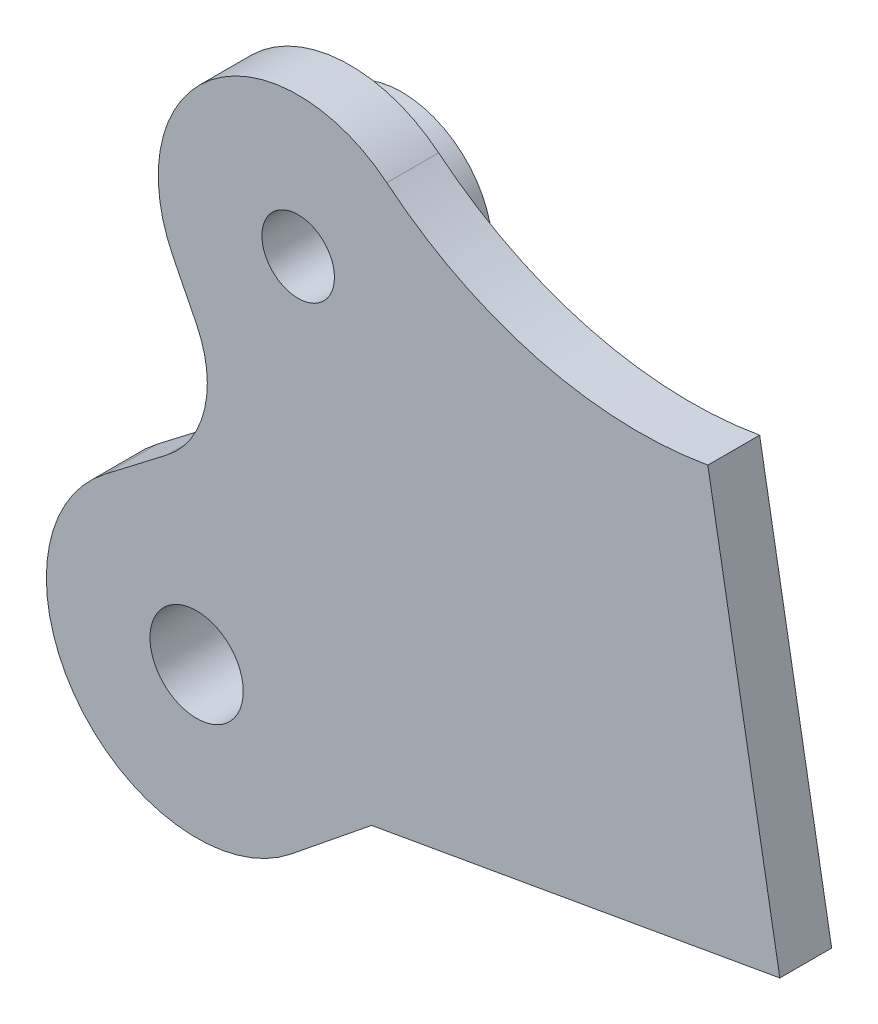
ISO-10303-21;
HEADER;
FILE_DESCRIPTION(('STEP AP214'),'2;1');
FILE_NAME('part.step','',(''),(''),'','','');
FILE_SCHEMA(('AUTOMOTIVE_DESIGN { 1 0 10303 214 1 1 1 1 }'));
ENDSEC;
DATA;
#1=APPLICATION_CONTEXT('core data for automotive mechanical design processes');
#2=APPLICATION_PROTOCOL_DEFINITION('international standard','automotive_design',2000,#1);
#3=PRODUCT_CONTEXT('',#1,'mechanical');
#4=PRODUCT('Part','Part','',(#3));
#5=PRODUCT_RELATED_PRODUCT_CATEGORY('part','',(#4));
#6=PRODUCT_DEFINITION_FORMATION('','',#4);
#7=PRODUCT_DEFINITION_CONTEXT('part definition',#1,'design');
#8=PRODUCT_DEFINITION('design','',#6,#7);
#9=PRODUCT_DEFINITION_SHAPE('','',#8);
#10=(LENGTH_UNIT() NAMED_UNIT(*) SI_UNIT(.MILLI.,.METRE.));
#11=(NAMED_UNIT(*) PLANE_ANGLE_UNIT() SI_UNIT($,.RADIAN.));
#12=(NAMED_UNIT(*) SI_UNIT($,.STERADIAN.) SOLID_ANGLE_UNIT());
#13=UNCERTAINTY_MEASURE_WITH_UNIT(LENGTH_MEASURE(1.E-05),#10,'distance_accuracy_value','');
#14=(GEOMETRIC_REPRESENTATION_CONTEXT(3) GLOBAL_UNCERTAINTY_ASSIGNED_CONTEXT((#13)) GLOBAL_UNIT_ASSIGNED_CONTEXT((#10,
#11,#12)) REPRESENTATION_CONTEXT('',''));
#15=CARTESIAN_POINT('',(0.,0.,0.));
#16=DIRECTION('',(0.,0.,1.));
#17=DIRECTION('',(1.,0.,0.));
#18=AXIS2_PLACEMENT_3D('',#15,#16,#17);
#19=CARTESIAN_POINT('',(0.,0.,-5.));
#20=DIRECTION('',(0.,0.,1.));
#21=DIRECTION('',(1.,0.,0.));
#22=AXIS2_PLACEMENT_3D('',#19,#20,#21);
#23=PLANE('',#22);
#24=CARTESIAN_POINT('',(0.,0.,-5.));
#25=DIRECTION('',(0.,0.,1.));
#26=DIRECTION('',(1.,0.,0.));
#27=AXIS2_PLACEMENT_3D('',#24,#25,#26);
#28=CIRCLE('',#27,8.75);
#29=CARTESIAN_POINT('',(8.75,0.,-5.));
#30=VERTEX_POINT('',#29);
#31=EDGE_CURVE('E40',#30,#30,#28,.F.);
#32=ORIENTED_EDGE('',*,*,#31,.F.);
#33=EDGE_LOOP('',(#32));
#34=FACE_BOUND('',#33,.T.);
#35=CARTESIAN_POINT('',(0.,0.,-5.));
#36=DIRECTION('',(0.,0.,1.));
#37=DIRECTION('',(1.,0.,0.));
#38=AXIS2_PLACEMENT_3D('',#35,#36,#37);
#39=CIRCLE('',#38,13.5);
#40=CARTESIAN_POINT('',(8.55471029514315,10.4435114672304,-5.));
#41=VERTEX_POINT('',#40);
#42=CARTESIAN_POINT('',(-12.0688625539661,-6.04917818000722,-5.));
#43=VERTEX_POINT('',#42);
#44=EDGE_CURVE('E162',#41,#43,#39,.T.);
#45=ORIENTED_EDGE('',*,*,#44,.F.);
#46=CARTESIAN_POINT('',(32.8720415648223,40.1298853134043,-5.));
#47=DIRECTION('',(0.,0.,-1.));
#48=DIRECTION('',(1.,0.,0.));
#49=AXIS2_PLACEMENT_3D('',#46,#47,#48);
#50=CIRCLE('',#49,38.3746451737878);
#51=CARTESIAN_POINT('',(39.5357287678656,2.33823722716558,-5.));
#52=VERTEX_POINT('',#51);
#53=EDGE_CURVE('E127',#52,#41,#50,.T.);
#54=ORIENTED_EDGE('',*,*,#53,.F.);
#55=DIRECTION('',(-0.173648177666932,0.984807753012208,0.));
#56=VECTOR('',#55,1.);
#57=CARTESIAN_POINT('',(46.4816558745429,-37.0540728933227,-5.));
#58=LINE('',#57,#56);
#59=CARTESIAN_POINT('',(46.4816558745429,-37.0540728933227,-5.));
#60=VERTEX_POINT('',#59);
#61=EDGE_CURVE('E112',#60,#52,#58,.T.);
#62=ORIENTED_EDGE('',*,*,#61,.F.);
#63=DIRECTION('',(0.984807753012208,0.173648177666931,0.));
#64=VECTOR('',#63,1.);
#65=CARTESIAN_POINT('',(7.08934575405454,-44.,-5.));
#66=LINE('',#65,#64);
#67=CARTESIAN_POINT('',(7.08934575405454,-44.,-5.));
#68=VERTEX_POINT('',#67);
#69=EDGE_CURVE('E125',#68,#60,#66,.T.);
#70=ORIENTED_EDGE('',*,*,#69,.F.);
#71=DIRECTION('',(0.778061104079115,0.628188600914716,0.));
#72=VECTOR('',#71,1.);
#73=CARTESIAN_POINT('',(-0.691265286736606,-50.2818860091472,-5.));
#74=LINE('',#73,#72);
#75=CARTESIAN_POINT('',(-0.691265286736614,-50.2818860091472,-5.));
#76=VERTEX_POINT('',#75);
#77=EDGE_CURVE('E130',#76,#68,#74,.T.);
#78=ORIENTED_EDGE('',*,*,#77,.F.);
#79=CARTESIAN_POINT('',(-9.79999999999999,-39.,-5.));
#80=DIRECTION('',(0.,0.,1.));
#81=DIRECTION('',(1.,0.,0.));
#82=AXIS2_PLACEMENT_3D('',#79,#80,#81);
#83=CIRCLE('',#82,14.5);
#84=CARTESIAN_POINT('',(-18.6271176616217,-27.4964356050881,-5.));
#85=VERTEX_POINT('',#84);
#86=EDGE_CURVE('E132',#85,#76,#83,.T.);
#87=ORIENTED_EDGE('',*,*,#86,.F.);
#88=DIRECTION('',(-0.793349268614616,-0.608766735284258,0.));
#89=VECTOR('',#88,1.);
#90=CARTESIAN_POINT('',(-12.6806570262809,-22.9334926861462,-5.));
#91=LINE('',#90,#89);
#92=CARTESIAN_POINT('',(-12.6806570262809,-22.9334926861462,-5.));
#93=VERTEX_POINT('',#92);
#94=EDGE_CURVE('E229',#93,#85,#91,.T.);
#95=ORIENTED_EDGE('',*,*,#94,.F.);
#96=CARTESIAN_POINT('',(-18.7683243791235,-15.,-5.));
#97=DIRECTION('',(0.,0.,-1.));
#98=DIRECTION('',(1.,0.,0.));
#99=AXIS2_PLACEMENT_3D('',#96,#97,#98);
#100=CIRCLE('',#99,10.);
#101=CARTESIAN_POINT('',(-9.82842619100044,-10.5191272740687,-5.));
#102=VERTEX_POINT('',#101);
#103=EDGE_CURVE('E222',#102,#93,#100,.T.);
#104=ORIENTED_EDGE('',*,*,#103,.F.);
#105=DIRECTION('',(0.448087272593127,-0.893989818812302,0.));
#106=VECTOR('',#105,1.);
#107=CARTESIAN_POINT('',(-12.0688625539661,-6.04917818000722,-5.));
#108=LINE('',#107,#106);
#109=EDGE_CURVE('E220',#43,#102,#108,.T.);
#110=ORIENTED_EDGE('',*,*,#109,.F.);
#111=EDGE_LOOP('',(#45,#54,#62,#70,#78,#87,#95,#104,#110));
#112=FACE_BOUND('',#111,.T.);
#113=CARTESIAN_POINT('',(-9.79999999999999,-39.,-5.));
#114=DIRECTION('',(0.,0.,1.));
#115=DIRECTION('',(1.,0.,0.));
#116=AXIS2_PLACEMENT_3D('',#113,#114,#115);
#117=CIRCLE('',#116,8.75);
#118=CARTESIAN_POINT('',(-1.04999999999999,-39.,-5.));
#119=VERTEX_POINT('',#118);
#120=EDGE_CURVE('E11',#119,#119,#117,.F.);
#121=ORIENTED_EDGE('',*,*,#120,.F.);
#122=EDGE_LOOP('',(#121));
#123=FACE_BOUND('',#122,.T.);
#124=ADVANCED_FACE('F31',(#34,#112,#123),#23,.F.);
#125=CARTESIAN_POINT('',(0.,0.,-5.));
#126=DIRECTION('',(0.,0.,1.));
#127=DIRECTION('',(1.,0.,0.));
#128=AXIS2_PLACEMENT_3D('',#125,#126,#127);
#129=CYLINDRICAL_SURFACE('',#128,13.5);
#130=CARTESIAN_POINT('',(0.,0.,0.));
#131=DIRECTION('',(0.,0.,1.));
#132=DIRECTION('',(1.,0.,0.));
#133=AXIS2_PLACEMENT_3D('',#130,#131,#132);
#134=CIRCLE('',#133,13.5);
#135=CARTESIAN_POINT('',(8.55471029514315,10.4435114672304,0.));
#136=VERTEX_POINT('',#135);
#137=CARTESIAN_POINT('',(-12.0688625539661,-6.04917818000722,0.));
#138=VERTEX_POINT('',#137);
#139=EDGE_CURVE('E137',#136,#138,#134,.T.);
#140=ORIENTED_EDGE('',*,*,#139,.F.);
#141=DIRECTION('',(0.,0.,1.));
#142=VECTOR('',#141,1.);
#143=CARTESIAN_POINT('',(8.55471029514315,10.4435114672304,-5.));
#144=LINE('',#143,#142);
#145=EDGE_CURVE('E48',#41,#136,#144,.T.);
#146=ORIENTED_EDGE('',*,*,#145,.F.);
#147=ORIENTED_EDGE('',*,*,#44,.T.);
#148=DIRECTION('',(0.,0.,1.));
#149=VECTOR('',#148,1.);
#150=CARTESIAN_POINT('',(-12.0688625539661,-6.04917818000722,-5.));
#151=LINE('',#150,#149);
#152=EDGE_CURVE('E92',#43,#138,#151,.T.);
#153=ORIENTED_EDGE('',*,*,#152,.T.);
#154=EDGE_LOOP('',(#140,#146,#147,#153));
#155=FACE_BOUND('',#154,.T.);
#156=ADVANCED_FACE('F33',(#155),#129,.T.);
#157=CARTESIAN_POINT('',(32.8720415648223,40.1298853134043,-5.));
#158=DIRECTION('',(0.,0.,1.));
#159=DIRECTION('',(1.,0.,0.));
#160=AXIS2_PLACEMENT_3D('',#157,#158,#159);
#161=CYLINDRICAL_SURFACE('',#160,38.3746451737878);
#162=CARTESIAN_POINT('',(32.8720415648223,40.1298853134043,0.));
#163=DIRECTION('',(0.,0.,-1.));
#164=DIRECTION('',(1.,0.,0.));
#165=AXIS2_PLACEMENT_3D('',#162,#163,#164);
#166=CIRCLE('',#165,38.3746451737878);
#167=CARTESIAN_POINT('',(39.5357287678656,2.33823722716558,0.));
#168=VERTEX_POINT('',#167);
#169=EDGE_CURVE('E159',#168,#136,#166,.T.);
#170=ORIENTED_EDGE('',*,*,#169,.F.);
#171=DIRECTION('',(0.,0.,1.));
#172=VECTOR('',#171,1.);
#173=CARTESIAN_POINT('',(39.5357287678656,2.33823722716558,-5.));
#174=LINE('',#173,#172);
#175=EDGE_CURVE('E80',#52,#168,#174,.T.);
#176=ORIENTED_EDGE('',*,*,#175,.F.);
#177=ORIENTED_EDGE('',*,*,#53,.T.);
#178=ORIENTED_EDGE('',*,*,#145,.T.);
#179=EDGE_LOOP('',(#170,#176,#177,#178));
#180=FACE_BOUND('',#179,.T.);
#181=ADVANCED_FACE('F184',(#180),#161,.F.);
#182=CARTESIAN_POINT('',(46.4816558745429,-37.0540728933227,-5.));
#183=DIRECTION('',(0.984807753012208,0.173648177666932,0.));
#184=DIRECTION('',(-0.173648177666932,0.984807753012208,0.));
#185=AXIS2_PLACEMENT_3D('',#182,#183,#184);
#186=PLANE('',#185);
#187=DIRECTION('',(-0.173648177666932,0.984807753012208,0.));
#188=VECTOR('',#187,1.);
#189=CARTESIAN_POINT('',(46.4816558745429,-37.0540728933227,0.));
#190=LINE('',#189,#188);
#191=CARTESIAN_POINT('',(46.4816558745429,-37.0540728933227,0.));
#192=VERTEX_POINT('',#191);
#193=EDGE_CURVE('E114',#192,#168,#190,.T.);
#194=ORIENTED_EDGE('',*,*,#193,.F.);
#195=DIRECTION('',(0.,0.,1.));
#196=VECTOR('',#195,1.);
#197=CARTESIAN_POINT('',(46.4816558745429,-37.0540728933227,-5.));
#198=LINE('',#197,#196);
#199=EDGE_CURVE('E109',#60,#192,#198,.T.);
#200=ORIENTED_EDGE('',*,*,#199,.F.);
#201=ORIENTED_EDGE('',*,*,#61,.T.);
#202=ORIENTED_EDGE('',*,*,#175,.T.);
#203=EDGE_LOOP('',(#194,#200,#201,#202));
#204=FACE_BOUND('',#203,.T.);
#205=ADVANCED_FACE('F111',(#204),#186,.T.);
#206=CARTESIAN_POINT('',(7.08934575405454,-44.,-5.));
#207=DIRECTION('',(0.173648177666931,-0.984807753012208,0.));
#208=DIRECTION('',(0.984807753012208,0.173648177666931,0.));
#209=AXIS2_PLACEMENT_3D('',#206,#207,#208);
#210=PLANE('',#209);
#211=DIRECTION('',(0.984807753012208,0.173648177666931,0.));
#212=VECTOR('',#211,1.);
#213=CARTESIAN_POINT('',(7.08934575405454,-44.,0.));
#214=LINE('',#213,#212);
#215=CARTESIAN_POINT('',(7.08934575405454,-44.,0.));
#216=VERTEX_POINT('',#215);
#217=EDGE_CURVE('E156',#216,#192,#214,.T.);
#218=ORIENTED_EDGE('',*,*,#217,.F.);
#219=DIRECTION('',(0.,0.,1.));
#220=VECTOR('',#219,1.);
#221=CARTESIAN_POINT('',(7.08934575405454,-44.,-5.));
#222=LINE('',#221,#220);
#223=EDGE_CURVE('E119',#68,#216,#222,.T.);
#224=ORIENTED_EDGE('',*,*,#223,.F.);
#225=ORIENTED_EDGE('',*,*,#69,.T.);
#226=ORIENTED_EDGE('',*,*,#199,.T.);
#227=EDGE_LOOP('',(#218,#224,#225,#226));
#228=FACE_BOUND('',#227,.T.);
#229=ADVANCED_FACE('F129',(#228),#210,.T.);
#230=CARTESIAN_POINT('',(-0.691265286736606,-50.2818860091472,-5.));
#231=DIRECTION('',(0.628188600914716,-0.778061104079115,0.));
#232=DIRECTION('',(0.778061104079115,0.628188600914716,0.));
#233=AXIS2_PLACEMENT_3D('',#230,#231,#232);
#234=PLANE('',#233);
#235=DIRECTION('',(0.778061104079115,0.628188600914716,0.));
#236=VECTOR('',#235,1.);
#237=CARTESIAN_POINT('',(-0.691265286736606,-50.2818860091472,0.));
#238=LINE('',#237,#236);
#239=CARTESIAN_POINT('',(-0.691265286736614,-50.2818860091472,0.));
#240=VERTEX_POINT('',#239);
#241=EDGE_CURVE('E153',#240,#216,#238,.T.);
#242=ORIENTED_EDGE('',*,*,#241,.F.);
#243=DIRECTION('',(0.,0.,1.));
#244=VECTOR('',#243,1.);
#245=CARTESIAN_POINT('',(-0.691265286736614,-50.2818860091472,-5.));
#246=LINE('',#245,#244);
#247=EDGE_CURVE('E166',#76,#240,#246,.T.);
#248=ORIENTED_EDGE('',*,*,#247,.F.);
#249=ORIENTED_EDGE('',*,*,#77,.T.);
#250=ORIENTED_EDGE('',*,*,#223,.T.);
#251=EDGE_LOOP('',(#242,#248,#249,#250));
#252=FACE_BOUND('',#251,.T.);
#253=ADVANCED_FACE('F200',(#252),#234,.T.);
#254=CARTESIAN_POINT('',(-9.79999999999999,-39.,-5.));
#255=DIRECTION('',(0.,0.,1.));
#256=DIRECTION('',(1.,0.,0.));
#257=AXIS2_PLACEMENT_3D('',#254,#255,#256);
#258=CYLINDRICAL_SURFACE('',#257,14.5);
#259=CARTESIAN_POINT('',(-9.79999999999999,-39.,0.));
#260=DIRECTION('',(0.,0.,1.));
#261=DIRECTION('',(1.,0.,0.));
#262=AXIS2_PLACEMENT_3D('',#259,#260,#261);
#263=CIRCLE('',#262,14.5);
#264=CARTESIAN_POINT('',(-18.6271176616217,-27.4964356050881,0.));
#265=VERTEX_POINT('',#264);
#266=EDGE_CURVE('E150',#265,#240,#263,.T.);
#267=ORIENTED_EDGE('',*,*,#266,.F.);
#268=DIRECTION('',(0.,0.,1.));
#269=VECTOR('',#268,1.);
#270=CARTESIAN_POINT('',(-18.6271176616217,-27.4964356050881,-5.));
#271=LINE('',#270,#269);
#272=EDGE_CURVE('E168',#85,#265,#271,.T.);
#273=ORIENTED_EDGE('',*,*,#272,.F.);
#274=ORIENTED_EDGE('',*,*,#86,.T.);
#275=ORIENTED_EDGE('',*,*,#247,.T.);
#276=EDGE_LOOP('',(#267,#273,#274,#275));
#277=FACE_BOUND('',#276,.T.);
#278=ADVANCED_FACE('F203',(#277),#258,.T.);
#279=CARTESIAN_POINT('',(-12.6806570262809,-22.9334926861462,-5.));
#280=DIRECTION('',(-0.608766735284258,0.793349268614616,0.));
#281=DIRECTION('',(-0.793349268614616,-0.608766735284258,0.));
#282=AXIS2_PLACEMENT_3D('',#279,#280,#281);
#283=PLANE('',#282);
#284=DIRECTION('',(-0.793349268614616,-0.608766735284258,0.));
#285=VECTOR('',#284,1.);
#286=CARTESIAN_POINT('',(-12.6806570262809,-22.9334926861462,0.));
#287=LINE('',#286,#285);
#288=CARTESIAN_POINT('',(-12.6806570262809,-22.9334926861462,0.));
#289=VERTEX_POINT('',#288);
#290=EDGE_CURVE('E147',#289,#265,#287,.T.);
#291=ORIENTED_EDGE('',*,*,#290,.F.);
#292=DIRECTION('',(0.,0.,1.));
#293=VECTOR('',#292,1.);
#294=CARTESIAN_POINT('',(-12.6806570262809,-22.9334926861462,-5.));
#295=LINE('',#294,#293);
#296=EDGE_CURVE('E170',#93,#289,#295,.T.);
#297=ORIENTED_EDGE('',*,*,#296,.F.);
#298=ORIENTED_EDGE('',*,*,#94,.T.);
#299=ORIENTED_EDGE('',*,*,#272,.T.);
#300=EDGE_LOOP('',(#291,#297,#298,#299));
#301=FACE_BOUND('',#300,.T.);
#302=ADVANCED_FACE('F207',(#301),#283,.T.);
#303=CARTESIAN_POINT('',(-18.7683243791235,-15.,-5.));
#304=DIRECTION('',(0.,0.,1.));
#305=DIRECTION('',(1.,0.,0.));
#306=AXIS2_PLACEMENT_3D('',#303,#304,#305);
#307=CYLINDRICAL_SURFACE('',#306,10.);
#308=CARTESIAN_POINT('',(-18.7683243791235,-15.,0.));
#309=DIRECTION('',(0.,0.,-1.));
#310=DIRECTION('',(1.,0.,0.));
#311=AXIS2_PLACEMENT_3D('',#308,#309,#310);
#312=CIRCLE('',#311,10.);
#313=CARTESIAN_POINT('',(-9.82842619100044,-10.5191272740687,0.));
#314=VERTEX_POINT('',#313);
#315=EDGE_CURVE('E144',#314,#289,#312,.T.);
#316=ORIENTED_EDGE('',*,*,#315,.F.);
#317=DIRECTION('',(0.,0.,1.));
#318=VECTOR('',#317,1.);
#319=CARTESIAN_POINT('',(-9.82842619100044,-10.5191272740687,-5.));
#320=LINE('',#319,#318);
#321=EDGE_CURVE('E172',#102,#314,#320,.T.);
#322=ORIENTED_EDGE('',*,*,#321,.F.);
#323=ORIENTED_EDGE('',*,*,#103,.T.);
#324=ORIENTED_EDGE('',*,*,#296,.T.);
#325=EDGE_LOOP('',(#316,#322,#323,#324));
#326=FACE_BOUND('',#325,.T.);
#327=ADVANCED_FACE('F211',(#326),#307,.F.);
#328=CARTESIAN_POINT('',(-12.0688625539661,-6.04917818000722,-5.));
#329=DIRECTION('',(-0.893989818812302,-0.448087272593127,0.));
#330=DIRECTION('',(0.448087272593127,-0.893989818812302,0.));
#331=AXIS2_PLACEMENT_3D('',#328,#329,#330);
#332=PLANE('',#331);
#333=DIRECTION('',(0.448087272593127,-0.893989818812302,0.));
#334=VECTOR('',#333,1.);
#335=CARTESIAN_POINT('',(-12.0688625539661,-6.04917818000722,0.));
#336=LINE('',#335,#334);
#337=EDGE_CURVE('E140',#138,#314,#336,.T.);
#338=ORIENTED_EDGE('',*,*,#337,.F.);
#339=ORIENTED_EDGE('',*,*,#152,.F.);
#340=ORIENTED_EDGE('',*,*,#109,.T.);
#341=ORIENTED_EDGE('',*,*,#321,.T.);
#342=EDGE_LOOP('',(#338,#339,#340,#341));
#343=FACE_BOUND('',#342,.T.);
#344=ADVANCED_FACE('F192',(#343),#332,.T.);
#345=CARTESIAN_POINT('',(0.,0.,0.));
#346=DIRECTION('',(0.,0.,1.));
#347=DIRECTION('',(1.,0.,0.));
#348=AXIS2_PLACEMENT_3D('',#345,#346,#347);
#349=PLANE('',#348);
#350=CARTESIAN_POINT('',(-9.79999999999999,-39.,0.));
#351=DIRECTION('',(0.,0.,1.));
#352=DIRECTION('',(1.,0.,0.));
#353=AXIS2_PLACEMENT_3D('',#350,#351,#352);
#354=CIRCLE('',#353,4.5);
#355=CARTESIAN_POINT('',(-5.29999999999999,-39.,0.));
#356=VERTEX_POINT('',#355);
#357=EDGE_CURVE('E239',#356,#356,#354,.T.);
#358=ORIENTED_EDGE('',*,*,#357,.F.);
#359=EDGE_LOOP('',(#358));
#360=FACE_BOUND('',#359,.T.);
#361=CARTESIAN_POINT('',(0.,0.,0.));
#362=DIRECTION('',(0.,0.,1.));
#363=DIRECTION('',(1.,0.,0.));
#364=AXIS2_PLACEMENT_3D('',#361,#362,#363);
#365=CIRCLE('',#364,3.5);
#366=CARTESIAN_POINT('',(3.5,0.,0.));
#367=VERTEX_POINT('',#366);
#368=EDGE_CURVE('E141',#367,#367,#365,.T.);
#369=ORIENTED_EDGE('',*,*,#368,.F.);
#370=EDGE_LOOP('',(#369));
#371=FACE_BOUND('',#370,.T.);
#372=ORIENTED_EDGE('',*,*,#139,.T.);
#373=ORIENTED_EDGE('',*,*,#337,.T.);
#374=ORIENTED_EDGE('',*,*,#315,.T.);
#375=ORIENTED_EDGE('',*,*,#290,.T.);
#376=ORIENTED_EDGE('',*,*,#266,.T.);
#377=ORIENTED_EDGE('',*,*,#241,.T.);
#378=ORIENTED_EDGE('',*,*,#217,.T.);
#379=ORIENTED_EDGE('',*,*,#193,.T.);
#380=ORIENTED_EDGE('',*,*,#169,.T.);
#381=EDGE_LOOP('',(#372,#373,#374,#375,#376,#377,#378,#379,#380));
#382=FACE_BOUND('',#381,.T.);
#383=ADVANCED_FACE('F189',(#360,#371,#382),#349,.T.);
#384=CARTESIAN_POINT('',(0.,0.,-5.));
#385=DIRECTION('',(0.,0.,1.));
#386=DIRECTION('',(1.,0.,0.));
#387=AXIS2_PLACEMENT_3D('',#384,#385,#386);
#388=CYLINDRICAL_SURFACE('',#387,3.5);
#389=ORIENTED_EDGE('',*,*,#368,.T.);
#390=EDGE_LOOP('',(#389));
#391=FACE_BOUND('',#390,.T.);
#392=CARTESIAN_POINT('',(0.,0.,-10.));
#393=DIRECTION('',(0.,0.,-1.));
#394=DIRECTION('',(-1.,0.,0.));
#395=AXIS2_PLACEMENT_3D('',#392,#393,#394);
#396=CIRCLE('',#395,3.5);
#397=CARTESIAN_POINT('',(-3.5,0.,-10.));
#398=VERTEX_POINT('',#397);
#399=EDGE_CURVE('E245',#398,#398,#396,.T.);
#400=ORIENTED_EDGE('',*,*,#399,.T.);
#401=EDGE_LOOP('',(#400));
#402=FACE_BOUND('',#401,.T.);
#403=ADVANCED_FACE('F187',(#391,#402),#388,.F.);
#404=CARTESIAN_POINT('',(-9.79999999999999,-39.,-5.));
#405=DIRECTION('',(0.,0.,1.));
#406=DIRECTION('',(1.,0.,0.));
#407=AXIS2_PLACEMENT_3D('',#404,#405,#406);
#408=CYLINDRICAL_SURFACE('',#407,4.5);
#409=ORIENTED_EDGE('',*,*,#357,.T.);
#410=EDGE_LOOP('',(#409));
#411=FACE_BOUND('',#410,.T.);
#412=CARTESIAN_POINT('',(-9.79999999999999,-39.,-10.));
#413=DIRECTION('',(0.,0.,-1.));
#414=DIRECTION('',(-1.,0.,0.));
#415=AXIS2_PLACEMENT_3D('',#412,#413,#414);
#416=CIRCLE('',#415,4.50000000000001);
#417=CARTESIAN_POINT('',(-14.3,-39.,-10.));
#418=VERTEX_POINT('',#417);
#419=EDGE_CURVE('E251',#418,#418,#416,.T.);
#420=ORIENTED_EDGE('',*,*,#419,.T.);
#421=EDGE_LOOP('',(#420));
#422=FACE_BOUND('',#421,.T.);
#423=ADVANCED_FACE('F255',(#411,#422),#408,.F.);
#424=CARTESIAN_POINT('',(0.,0.,-10.));
#425=DIRECTION('',(0.,0.,-1.));
#426=DIRECTION('',(-1.,0.,0.));
#427=AXIS2_PLACEMENT_3D('',#424,#425,#426);
#428=PLANE('',#427);
#429=CARTESIAN_POINT('',(0.,0.,-10.));
#430=DIRECTION('',(0.,0.,-1.));
#431=DIRECTION('',(-1.,0.,0.));
#432=AXIS2_PLACEMENT_3D('',#429,#430,#431);
#433=CIRCLE('',#432,8.75);
#434=CARTESIAN_POINT('',(-8.75,0.,-10.));
#435=VERTEX_POINT('',#434);
#436=EDGE_CURVE('E242',#435,#435,#433,.T.);
#437=ORIENTED_EDGE('',*,*,#436,.T.);
#438=EDGE_LOOP('',(#437));
#439=FACE_BOUND('',#438,.T.);
#440=ORIENTED_EDGE('',*,*,#399,.F.);
#441=EDGE_LOOP('',(#440));
#442=FACE_BOUND('',#441,.T.);
#443=ADVANCED_FACE('F268',(#439,#442),#428,.T.);
#444=CARTESIAN_POINT('',(0.,0.,-10.));
#445=DIRECTION('',(0.,0.,1.));
#446=DIRECTION('',(1.,0.,0.));
#447=AXIS2_PLACEMENT_3D('',#444,#445,#446);
#448=CYLINDRICAL_SURFACE('',#447,8.75);
#449=ORIENTED_EDGE('',*,*,#436,.F.);
#450=EDGE_LOOP('',(#449));
#451=FACE_BOUND('',#450,.T.);
#452=ORIENTED_EDGE('',*,*,#31,.T.);
#453=EDGE_LOOP('',(#452));
#454=FACE_BOUND('',#453,.T.);
#455=ADVANCED_FACE('F177',(#451,#454),#448,.T.);
#456=CARTESIAN_POINT('',(-9.79999999999999,-39.,-10.));
#457=DIRECTION('',(0.,0.,-1.));
#458=DIRECTION('',(-1.,0.,0.));
#459=AXIS2_PLACEMENT_3D('',#456,#457,#458);
#460=PLANE('',#459);
#461=CARTESIAN_POINT('',(-9.79999999999999,-39.,-10.));
#462=DIRECTION('',(0.,0.,-1.));
#463=DIRECTION('',(-1.,0.,0.));
#464=AXIS2_PLACEMENT_3D('',#461,#462,#463);
#465=CIRCLE('',#464,8.75);
#466=CARTESIAN_POINT('',(-18.55,-39.,-10.));
#467=VERTEX_POINT('',#466);
#468=EDGE_CURVE('E248',#467,#467,#465,.T.);
#469=ORIENTED_EDGE('',*,*,#468,.T.);
#470=EDGE_LOOP('',(#469));
#471=FACE_BOUND('',#470,.T.);
#472=ORIENTED_EDGE('',*,*,#419,.F.);
#473=EDGE_LOOP('',(#472));
#474=FACE_BOUND('',#473,.T.);
#475=ADVANCED_FACE('F257',(#471,#474),#460,.T.);
#476=CARTESIAN_POINT('',(-9.79999999999999,-39.,-10.));
#477=DIRECTION('',(0.,0.,1.));
#478=DIRECTION('',(1.,0.,0.));
#479=AXIS2_PLACEMENT_3D('',#476,#477,#478);
#480=CYLINDRICAL_SURFACE('',#479,8.75);
#481=ORIENTED_EDGE('',*,*,#468,.F.);
#482=EDGE_LOOP('',(#481));
#483=FACE_BOUND('',#482,.T.);
#484=ORIENTED_EDGE('',*,*,#120,.T.);
#485=EDGE_LOOP('',(#484));
#486=FACE_BOUND('',#485,.T.);
#487=ADVANCED_FACE('F259',(#483,#486),#480,.T.);
#488=CLOSED_SHELL('',(#124,#156,#181,#205,#229,#253,#278,#302,#327,#344,#383,#403,#423,#443,
#455,#475,#487));
#489=MANIFOLD_SOLID_BREP('B2',#488);
#490=ADVANCED_BREP_SHAPE_REPRESENTATION('',(#18,#489),#14);
#491=SHAPE_DEFINITION_REPRESENTATION(#9,#490);
ENDSEC;
END-ISO-10303-21;
